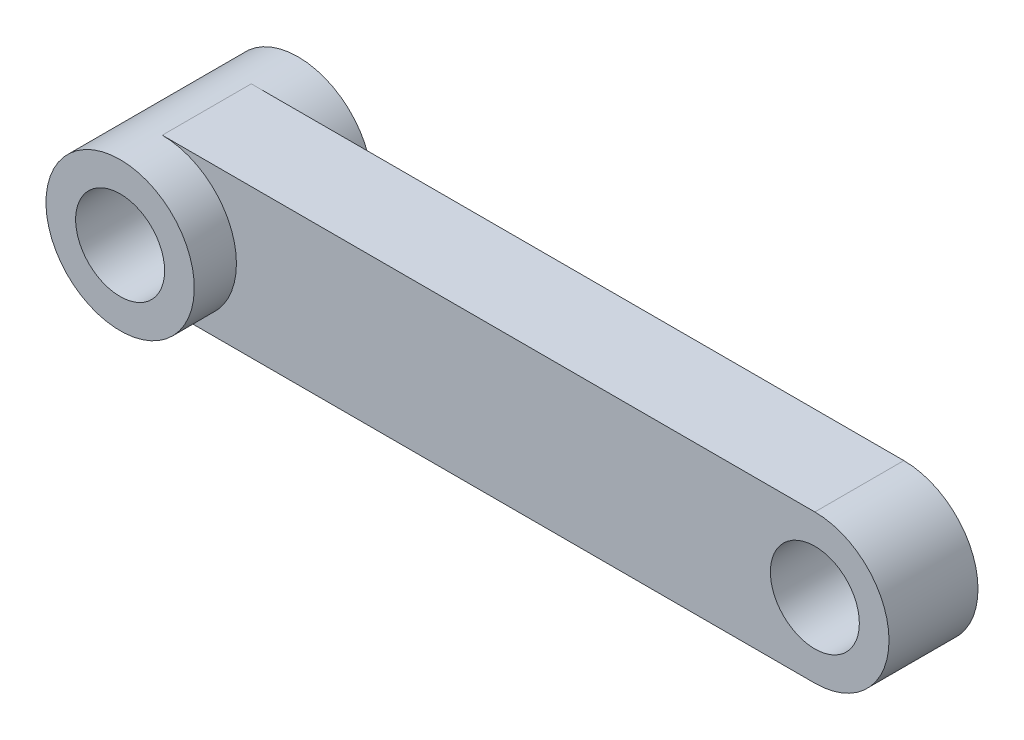
ISO-10303-21;
HEADER;
FILE_DESCRIPTION(('STEP AP214'),'2;1');
FILE_NAME('part.step','',(''),(''),'','','');
FILE_SCHEMA(('AUTOMOTIVE_DESIGN { 1 0 10303 214 1 1 1 1 }'));
ENDSEC;
DATA;
#1=APPLICATION_CONTEXT('core data for automotive mechanical design processes');
#2=APPLICATION_PROTOCOL_DEFINITION('international standard','automotive_design',2000,#1);
#3=PRODUCT_CONTEXT('',#1,'mechanical');
#4=PRODUCT('Part','Part','',(#3));
#5=PRODUCT_RELATED_PRODUCT_CATEGORY('part','',(#4));
#6=PRODUCT_DEFINITION_FORMATION('','',#4);
#7=PRODUCT_DEFINITION_CONTEXT('part definition',#1,'design');
#8=PRODUCT_DEFINITION('design','',#6,#7);
#9=PRODUCT_DEFINITION_SHAPE('','',#8);
#10=(LENGTH_UNIT() NAMED_UNIT(*) SI_UNIT(.MILLI.,.METRE.));
#11=(NAMED_UNIT(*) PLANE_ANGLE_UNIT() SI_UNIT($,.RADIAN.));
#12=(NAMED_UNIT(*) SI_UNIT($,.STERADIAN.) SOLID_ANGLE_UNIT());
#13=UNCERTAINTY_MEASURE_WITH_UNIT(LENGTH_MEASURE(1.E-05),#10,'distance_accuracy_value','');
#14=(GEOMETRIC_REPRESENTATION_CONTEXT(3) GLOBAL_UNCERTAINTY_ASSIGNED_CONTEXT((#13)) GLOBAL_UNIT_ASSIGNED_CONTEXT((#10,
#11,#12)) REPRESENTATION_CONTEXT('',''));
#15=CARTESIAN_POINT('',(0.,0.,0.));
#16=DIRECTION('',(0.,0.,1.));
#17=DIRECTION('',(1.,0.,0.));
#18=AXIS2_PLACEMENT_3D('',#15,#16,#17);
#19=CARTESIAN_POINT('',(0.,0.,3.));
#20=DIRECTION('',(0.,0.,1.));
#21=DIRECTION('',(1.,0.,0.));
#22=AXIS2_PLACEMENT_3D('',#19,#20,#21);
#23=PLANE('',#22);
#24=CARTESIAN_POINT('',(191.551801515187,-29.6689932137893,3.));
#25=DIRECTION('',(0.,0.,1.));
#26=DIRECTION('',(1.,0.,0.));
#27=AXIS2_PLACEMENT_3D('',#24,#25,#26);
#28=CIRCLE('',#27,1.50000000000002);
#29=CARTESIAN_POINT('',(193.051801515187,-29.6689932137893,3.));
#30=VERTEX_POINT('',#29);
#31=EDGE_CURVE('E91',#30,#30,#28,.F.);
#32=ORIENTED_EDGE('',*,*,#31,.T.);
#33=EDGE_LOOP('',(#32));
#34=FACE_BOUND('',#33,.T.);
#35=DIRECTION('',(1.,0.,0.));
#36=VECTOR('',#35,1.);
#37=CARTESIAN_POINT('',(0.,-27.1689932137895,3.));
#38=LINE('',#37,#36);
#39=CARTESIAN_POINT('',(169.551801515187,-27.1689932137893,3.));
#40=VERTEX_POINT('',#39);
#41=CARTESIAN_POINT('',(191.551801515187,-27.1689932137893,3.));
#42=VERTEX_POINT('',#41);
#43=EDGE_CURVE('E110',#40,#42,#38,.T.);
#44=ORIENTED_EDGE('',*,*,#43,.F.);
#45=CARTESIAN_POINT('',(169.551801515187,-29.6689932137893,3.));
#46=DIRECTION('',(0.,0.,1.));
#47=DIRECTION('',(1.,0.,0.));
#48=AXIS2_PLACEMENT_3D('',#45,#46,#47);
#49=CIRCLE('',#48,2.5);
#50=CARTESIAN_POINT('',(169.551801515187,-32.1689932137892,3.));
#51=VERTEX_POINT('',#50);
#52=EDGE_CURVE('E52',#40,#51,#49,.F.);
#53=ORIENTED_EDGE('',*,*,#52,.T.);
#54=DIRECTION('',(-1.,0.,0.));
#55=VECTOR('',#54,1.);
#56=CARTESIAN_POINT('',(0.,-32.168993213789,3.));
#57=LINE('',#56,#55);
#58=CARTESIAN_POINT('',(191.551801515187,-32.1689932137893,3.));
#59=VERTEX_POINT('',#58);
#60=EDGE_CURVE('E88',#59,#51,#57,.T.);
#61=ORIENTED_EDGE('',*,*,#60,.F.);
#62=CARTESIAN_POINT('',(191.551801515187,-29.6689932137893,3.));
#63=DIRECTION('',(0.,0.,1.));
#64=DIRECTION('',(1.,0.,0.));
#65=AXIS2_PLACEMENT_3D('',#62,#63,#64);
#66=CIRCLE('',#65,2.49999999999999);
#67=EDGE_CURVE('E109',#42,#59,#66,.F.);
#68=ORIENTED_EDGE('',*,*,#67,.F.);
#69=EDGE_LOOP('',(#44,#53,#61,#68));
#70=FACE_BOUND('',#69,.T.);
#71=ADVANCED_FACE('F35',(#34,#70),#23,.T.);
#72=CARTESIAN_POINT('',(0.,0.,0.));
#73=DIRECTION('',(0.,0.,1.));
#74=DIRECTION('',(1.,0.,0.));
#75=AXIS2_PLACEMENT_3D('',#72,#73,#74);
#76=PLANE('',#75);
#77=CARTESIAN_POINT('',(191.551801515187,-29.6689932137893,0.));
#78=DIRECTION('',(0.,0.,1.));
#79=DIRECTION('',(1.,0.,0.));
#80=AXIS2_PLACEMENT_3D('',#77,#78,#79);
#81=CIRCLE('',#80,1.50000000000002);
#82=CARTESIAN_POINT('',(193.051801515187,-29.6689932137893,0.));
#83=VERTEX_POINT('',#82);
#84=EDGE_CURVE('E99',#83,#83,#81,.F.);
#85=ORIENTED_EDGE('',*,*,#84,.F.);
#86=EDGE_LOOP('',(#85));
#87=FACE_BOUND('',#86,.T.);
#88=CARTESIAN_POINT('',(169.551801515187,-29.6689932137893,0.));
#89=DIRECTION('',(0.,0.,1.));
#90=DIRECTION('',(1.,0.,0.));
#91=AXIS2_PLACEMENT_3D('',#88,#89,#90);
#92=CIRCLE('',#91,2.5);
#93=CARTESIAN_POINT('',(169.551801515187,-27.1689932137893,0.));
#94=VERTEX_POINT('',#93);
#95=CARTESIAN_POINT('',(169.551801515187,-32.1689932137892,0.));
#96=VERTEX_POINT('',#95);
#97=EDGE_CURVE('E11',#94,#96,#92,.F.);
#98=ORIENTED_EDGE('',*,*,#97,.F.);
#99=DIRECTION('',(1.,0.,0.));
#100=VECTOR('',#99,1.);
#101=CARTESIAN_POINT('',(0.,-27.1689932137895,0.));
#102=LINE('',#101,#100);
#103=CARTESIAN_POINT('',(191.551801515187,-27.1689932137893,0.));
#104=VERTEX_POINT('',#103);
#105=EDGE_CURVE('E97',#94,#104,#102,.T.);
#106=ORIENTED_EDGE('',*,*,#105,.T.);
#107=CARTESIAN_POINT('',(191.551801515187,-29.6689932137893,0.));
#108=DIRECTION('',(0.,0.,1.));
#109=DIRECTION('',(1.,0.,0.));
#110=AXIS2_PLACEMENT_3D('',#107,#108,#109);
#111=CIRCLE('',#110,2.49999999999999);
#112=CARTESIAN_POINT('',(191.551801515187,-32.1689932137893,0.));
#113=VERTEX_POINT('',#112);
#114=EDGE_CURVE('E85',#104,#113,#111,.F.);
#115=ORIENTED_EDGE('',*,*,#114,.T.);
#116=DIRECTION('',(-1.,0.,0.));
#117=VECTOR('',#116,1.);
#118=CARTESIAN_POINT('',(0.,-32.168993213789,0.));
#119=LINE('',#118,#117);
#120=EDGE_CURVE('E82',#113,#96,#119,.T.);
#121=ORIENTED_EDGE('',*,*,#120,.T.);
#122=EDGE_LOOP('',(#98,#106,#115,#121));
#123=FACE_BOUND('',#122,.T.);
#124=ADVANCED_FACE('F84',(#87,#123),#76,.F.);
#125=CARTESIAN_POINT('',(0.,-32.168993213789,3.));
#126=DIRECTION('',(0.,-1.,0.));
#127=DIRECTION('',(1.,0.,0.));
#128=AXIS2_PLACEMENT_3D('',#125,#126,#127);
#129=PLANE('',#128);
#130=ORIENTED_EDGE('',*,*,#120,.F.);
#131=DIRECTION('',(0.,0.,-1.));
#132=VECTOR('',#131,1.);
#133=CARTESIAN_POINT('',(191.551801515187,-32.1689932137893,3.));
#134=LINE('',#133,#132);
#135=EDGE_CURVE('E44',#59,#113,#134,.T.);
#136=ORIENTED_EDGE('',*,*,#135,.F.);
#137=ORIENTED_EDGE('',*,*,#60,.T.);
#138=DIRECTION('',(0.,0.,-1.));
#139=VECTOR('',#138,1.);
#140=CARTESIAN_POINT('',(169.551801515187,-32.1689932137892,3.));
#141=LINE('',#140,#139);
#142=EDGE_CURVE('E87',#51,#96,#141,.T.);
#143=ORIENTED_EDGE('',*,*,#142,.T.);
#144=EDGE_LOOP('',(#130,#136,#137,#143));
#145=FACE_BOUND('',#144,.T.);
#146=ADVANCED_FACE('F37',(#145),#129,.T.);
#147=CARTESIAN_POINT('',(191.551801515187,-29.6689932137893,3.));
#148=DIRECTION('',(0.,0.,-1.));
#149=DIRECTION('',(-1.,0.,0.));
#150=AXIS2_PLACEMENT_3D('',#147,#148,#149);
#151=CYLINDRICAL_SURFACE('',#150,2.49999999999999);
#152=ORIENTED_EDGE('',*,*,#114,.F.);
#153=DIRECTION('',(0.,0.,-1.));
#154=VECTOR('',#153,1.);
#155=CARTESIAN_POINT('',(191.551801515187,-27.1689932137893,3.));
#156=LINE('',#155,#154);
#157=EDGE_CURVE('E67',#42,#104,#156,.T.);
#158=ORIENTED_EDGE('',*,*,#157,.F.);
#159=ORIENTED_EDGE('',*,*,#67,.T.);
#160=ORIENTED_EDGE('',*,*,#135,.T.);
#161=EDGE_LOOP('',(#152,#158,#159,#160));
#162=FACE_BOUND('',#161,.T.);
#163=ADVANCED_FACE('F107',(#162),#151,.T.);
#164=CARTESIAN_POINT('',(0.,-27.1689932137895,3.));
#165=DIRECTION('',(0.,1.,0.));
#166=DIRECTION('',(-1.,0.,0.));
#167=AXIS2_PLACEMENT_3D('',#164,#165,#166);
#168=PLANE('',#167);
#169=ORIENTED_EDGE('',*,*,#105,.F.);
#170=DIRECTION('',(0.,0.,-1.));
#171=VECTOR('',#170,1.);
#172=CARTESIAN_POINT('',(169.551801515187,-27.1689932137893,3.));
#173=LINE('',#172,#171);
#174=EDGE_CURVE('E90',#40,#94,#173,.T.);
#175=ORIENTED_EDGE('',*,*,#174,.F.);
#176=ORIENTED_EDGE('',*,*,#43,.T.);
#177=ORIENTED_EDGE('',*,*,#157,.T.);
#178=EDGE_LOOP('',(#169,#175,#176,#177));
#179=FACE_BOUND('',#178,.T.);
#180=ADVANCED_FACE('F98',(#179),#168,.T.);
#181=CARTESIAN_POINT('',(169.551801515187,-29.6689932137893,3.));
#182=DIRECTION('',(0.,0.,-1.));
#183=DIRECTION('',(-1.,0.,0.));
#184=AXIS2_PLACEMENT_3D('',#181,#182,#183);
#185=CYLINDRICAL_SURFACE('',#184,2.49999999999997);
#186=ORIENTED_EDGE('',*,*,#174,.T.);
#187=ORIENTED_EDGE('',*,*,#97,.T.);
#188=ORIENTED_EDGE('',*,*,#142,.F.);
#189=ORIENTED_EDGE('',*,*,#52,.F.);
#190=EDGE_LOOP('',(#186,#187,#188,#189));
#191=FACE_BOUND('',#190,.T.);
#192=CARTESIAN_POINT('',(169.551801515187,-29.6689932137893,-1.5788733093457));
#193=DIRECTION('',(0.,0.,-1.));
#194=DIRECTION('',(0.,1.,0.));
#195=AXIS2_PLACEMENT_3D('',#192,#193,#194);
#196=CIRCLE('',#195,2.5);
#197=CARTESIAN_POINT('',(169.551801515187,-27.1689932137893,-1.5788733093457));
#198=VERTEX_POINT('',#197);
#199=EDGE_CURVE('E234',#198,#198,#196,.T.);
#200=ORIENTED_EDGE('',*,*,#199,.F.);
#201=EDGE_LOOP('',(#200));
#202=FACE_BOUND('',#201,.T.);
#203=CARTESIAN_POINT('',(169.551801515187,-29.6689932137893,4.4211266906543));
#204=DIRECTION('',(0.,0.,-1.));
#205=DIRECTION('',(0.,1.,0.));
#206=AXIS2_PLACEMENT_3D('',#203,#204,#205);
#207=CIRCLE('',#206,2.5);
#208=CARTESIAN_POINT('',(169.551801515187,-27.1689932137893,4.4211266906543));
#209=VERTEX_POINT('',#208);
#210=EDGE_CURVE('E229',#209,#209,#207,.F.);
#211=ORIENTED_EDGE('',*,*,#210,.F.);
#212=EDGE_LOOP('',(#211));
#213=FACE_BOUND('',#212,.T.);
#214=ADVANCED_FACE('F93',(#191,#202,#213),#185,.T.);
#215=CARTESIAN_POINT('',(191.551801515187,-29.6689932137893,3.));
#216=DIRECTION('',(0.,0.,-1.));
#217=DIRECTION('',(-1.,0.,0.));
#218=AXIS2_PLACEMENT_3D('',#215,#216,#217);
#219=CYLINDRICAL_SURFACE('',#218,1.50000000000002);
#220=ORIENTED_EDGE('',*,*,#31,.F.);
#221=EDGE_LOOP('',(#220));
#222=FACE_BOUND('',#221,.T.);
#223=ORIENTED_EDGE('',*,*,#84,.T.);
#224=EDGE_LOOP('',(#223));
#225=FACE_BOUND('',#224,.T.);
#226=ADVANCED_FACE('F120',(#222,#225),#219,.F.);
#227=CARTESIAN_POINT('',(93.7187821992358,-184.192181560367,-1.57887330934615));
#228=DIRECTION('',(0.,0.,-1.));
#229=DIRECTION('',(-0.279231137623937,-0.960223917521971,0.));
#230=AXIS2_PLACEMENT_3D('',#227,#228,#229);
#231=PLANE('',#230);
#232=CARTESIAN_POINT('',(169.551801515187,-29.6689932137894,-1.5788733093457));
#233=DIRECTION('',(0.,0.,-1.));
#234=DIRECTION('',(-0.279231137623937,-0.960223917521971,0.));
#235=AXIS2_PLACEMENT_3D('',#232,#233,#234);
#236=CIRCLE('',#235,1.5);
#237=CARTESIAN_POINT('',(169.132954808751,-31.1093290900723,-1.57887330934571));
#238=VERTEX_POINT('',#237);
#239=EDGE_CURVE('E237',#238,#238,#236,.F.);
#240=ORIENTED_EDGE('',*,*,#239,.T.);
#241=EDGE_LOOP('',(#240));
#242=FACE_BOUND('',#241,.T.);
#243=ORIENTED_EDGE('',*,*,#199,.T.);
#244=EDGE_LOOP('',(#243));
#245=FACE_BOUND('',#244,.T.);
#246=ADVANCED_FACE('F123',(#242,#245),#231,.T.);
#247=CARTESIAN_POINT('',(169.551801515187,-29.6689932137893,3.));
#248=DIRECTION('',(0.,0.,-1.));
#249=DIRECTION('',(-1.,0.,0.));
#250=AXIS2_PLACEMENT_3D('',#247,#248,#249);
#251=CYLINDRICAL_SURFACE('',#250,1.5);
#252=ORIENTED_EDGE('',*,*,#239,.F.);
#253=EDGE_LOOP('',(#252));
#254=FACE_BOUND('',#253,.T.);
#255=CARTESIAN_POINT('',(169.551801515187,-29.6689932137894,4.4211266906543));
#256=DIRECTION('',(0.,0.,-1.));
#257=DIRECTION('',(-0.279231137623937,-0.960223917521971,0.));
#258=AXIS2_PLACEMENT_3D('',#255,#256,#257);
#259=CIRCLE('',#258,1.5);
#260=CARTESIAN_POINT('',(169.132954808751,-31.1093290900723,4.42112669065429));
#261=VERTEX_POINT('',#260);
#262=EDGE_CURVE('E232',#261,#261,#259,.F.);
#263=ORIENTED_EDGE('',*,*,#262,.T.);
#264=EDGE_LOOP('',(#263));
#265=FACE_BOUND('',#264,.T.);
#266=ADVANCED_FACE('F136',(#254,#265),#251,.F.);
#267=CARTESIAN_POINT('',(93.7187821992358,-184.192181560367,4.42112669065385));
#268=DIRECTION('',(0.,0.,-1.));
#269=DIRECTION('',(-0.279231137623937,-0.960223917521971,0.));
#270=AXIS2_PLACEMENT_3D('',#267,#268,#269);
#271=PLANE('',#270);
#272=ORIENTED_EDGE('',*,*,#210,.T.);
#273=EDGE_LOOP('',(#272));
#274=FACE_BOUND('',#273,.T.);
#275=ORIENTED_EDGE('',*,*,#262,.F.);
#276=EDGE_LOOP('',(#275));
#277=FACE_BOUND('',#276,.T.);
#278=ADVANCED_FACE('F139',(#274,#277),#271,.F.);
#279=CLOSED_SHELL('',(#71,#124,#146,#163,#180,#214,#226,#246,#266,#278));
#280=MANIFOLD_SOLID_BREP('B2',#279);
#281=ADVANCED_BREP_SHAPE_REPRESENTATION('',(#18,#280),#14);
#282=SHAPE_DEFINITION_REPRESENTATION(#9,#281);
ENDSEC;
END-ISO-10303-21;
